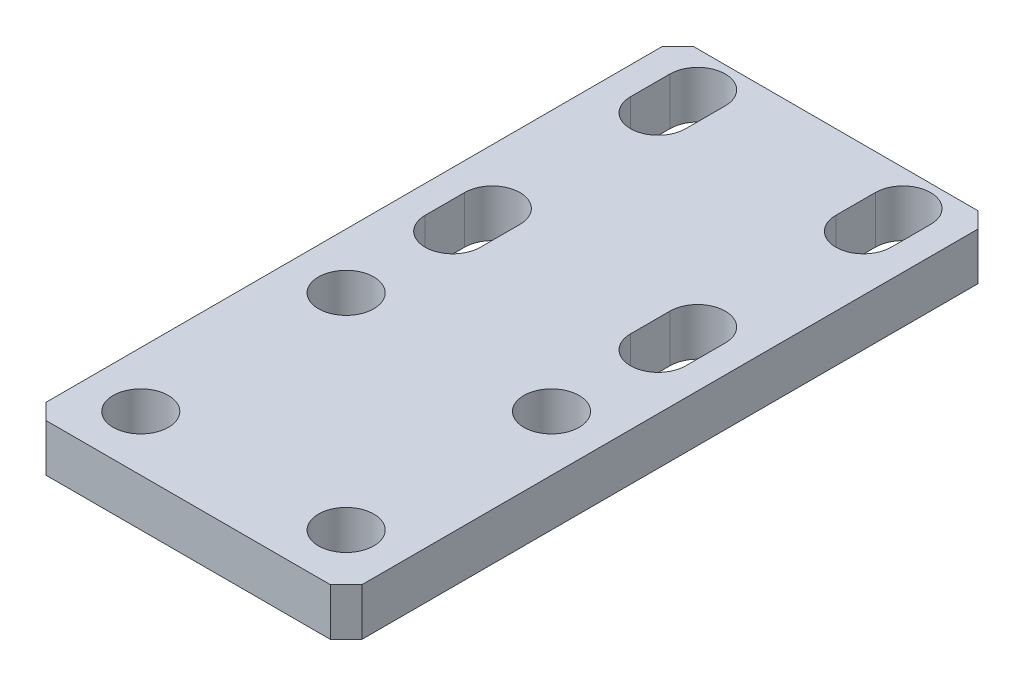
ISO-10303-21;
HEADER;
FILE_DESCRIPTION(('STEP AP214'),'2;1');
FILE_NAME('part.step','',(''),(''),'','','');
FILE_SCHEMA(('AUTOMOTIVE_DESIGN { 1 0 10303 214 1 1 1 1 }'));
ENDSEC;
DATA;
#1=APPLICATION_CONTEXT('core data for automotive mechanical design processes');
#2=APPLICATION_PROTOCOL_DEFINITION('international standard','automotive_design',2000,#1);
#3=PRODUCT_CONTEXT('',#1,'mechanical');
#4=PRODUCT('Part','Part','',(#3));
#5=PRODUCT_RELATED_PRODUCT_CATEGORY('part','',(#4));
#6=PRODUCT_DEFINITION_FORMATION('','',#4);
#7=PRODUCT_DEFINITION_CONTEXT('part definition',#1,'design');
#8=PRODUCT_DEFINITION('design','',#6,#7);
#9=PRODUCT_DEFINITION_SHAPE('','',#8);
#10=(LENGTH_UNIT() NAMED_UNIT(*) SI_UNIT(.MILLI.,.METRE.));
#11=(NAMED_UNIT(*) PLANE_ANGLE_UNIT() SI_UNIT($,.RADIAN.));
#12=(NAMED_UNIT(*) SI_UNIT($,.STERADIAN.) SOLID_ANGLE_UNIT());
#13=UNCERTAINTY_MEASURE_WITH_UNIT(LENGTH_MEASURE(1.E-05),#10,'distance_accuracy_value','');
#14=(GEOMETRIC_REPRESENTATION_CONTEXT(3) GLOBAL_UNCERTAINTY_ASSIGNED_CONTEXT((#13)) GLOBAL_UNIT_ASSIGNED_CONTEXT((#10,
#11,#12)) REPRESENTATION_CONTEXT('',''));
#15=CARTESIAN_POINT('',(0.,0.,0.));
#16=DIRECTION('',(0.,0.,1.));
#17=DIRECTION('',(1.,0.,0.));
#18=AXIS2_PLACEMENT_3D('',#15,#16,#17);
#19=CARTESIAN_POINT('',(0.,-3.,0.));
#20=DIRECTION('',(0.,1.,0.));
#21=DIRECTION('',(0.,0.,1.));
#22=AXIS2_PLACEMENT_3D('',#19,#20,#21);
#23=PLANE('',#22);
#24=CARTESIAN_POINT('',(13.,-3.,34.));
#25=DIRECTION('',(0.,1.,0.));
#26=DIRECTION('',(0.,0.,1.));
#27=AXIS2_PLACEMENT_3D('',#24,#25,#26);
#28=CIRCLE('',#27,3.5);
#29=CARTESIAN_POINT('',(13.,-3.,37.5));
#30=VERTEX_POINT('',#29);
#31=EDGE_CURVE('E284',#30,#30,#28,.T.);
#32=ORIENTED_EDGE('',*,*,#31,.T.);
#33=EDGE_LOOP('',(#32));
#34=FACE_BOUND('',#33,.T.);
#35=CARTESIAN_POINT('',(-13.,-3.,34.));
#36=DIRECTION('',(0.,1.,0.));
#37=DIRECTION('',(0.,0.,1.));
#38=AXIS2_PLACEMENT_3D('',#35,#36,#37);
#39=CIRCLE('',#38,3.5);
#40=CARTESIAN_POINT('',(-13.,-3.,37.5));
#41=VERTEX_POINT('',#40);
#42=EDGE_CURVE('E288',#41,#41,#39,.T.);
#43=ORIENTED_EDGE('',*,*,#42,.T.);
#44=EDGE_LOOP('',(#43));
#45=FACE_BOUND('',#44,.T.);
#46=CARTESIAN_POINT('',(-13.,-3.,8.00000000000002));
#47=DIRECTION('',(0.,1.,0.));
#48=DIRECTION('',(0.,0.,1.));
#49=AXIS2_PLACEMENT_3D('',#46,#47,#48);
#50=CIRCLE('',#49,3.5);
#51=CARTESIAN_POINT('',(-13.,-3.,11.5));
#52=VERTEX_POINT('',#51);
#53=EDGE_CURVE('E291',#52,#52,#50,.T.);
#54=ORIENTED_EDGE('',*,*,#53,.T.);
#55=EDGE_LOOP('',(#54));
#56=FACE_BOUND('',#55,.T.);
#57=DIRECTION('',(0.,0.,1.));
#58=VECTOR('',#57,1.);
#59=CARTESIAN_POINT('',(9.49999999999999,-3.,-36.5));
#60=LINE('',#59,#58);
#61=CARTESIAN_POINT('',(9.49999999999999,-3.,-36.5));
#62=VERTEX_POINT('',#61);
#63=CARTESIAN_POINT('',(9.49999999999999,-3.,-31.5));
#64=VERTEX_POINT('',#63);
#65=EDGE_CURVE('E221',#62,#64,#60,.T.);
#66=ORIENTED_EDGE('',*,*,#65,.T.);
#67=CARTESIAN_POINT('',(13.,-3.,-31.5));
#68=DIRECTION('',(0.,1.,0.));
#69=DIRECTION('',(0.,0.,1.));
#70=AXIS2_PLACEMENT_3D('',#67,#68,#69);
#71=CIRCLE('',#70,3.5);
#72=CARTESIAN_POINT('',(16.5,-3.,-31.5));
#73=VERTEX_POINT('',#72);
#74=EDGE_CURVE('E224',#64,#73,#71,.T.);
#75=ORIENTED_EDGE('',*,*,#74,.T.);
#76=DIRECTION('',(0.,0.,-1.));
#77=VECTOR('',#76,1.);
#78=CARTESIAN_POINT('',(16.5,-3.,-36.5));
#79=LINE('',#78,#77);
#80=CARTESIAN_POINT('',(16.5,-3.,-36.5));
#81=VERTEX_POINT('',#80);
#82=EDGE_CURVE('E218',#73,#81,#79,.T.);
#83=ORIENTED_EDGE('',*,*,#82,.T.);
#84=CARTESIAN_POINT('',(13.,-3.,-36.5));
#85=DIRECTION('',(0.,1.,0.));
#86=DIRECTION('',(0.,0.,1.));
#87=AXIS2_PLACEMENT_3D('',#84,#85,#86);
#88=CIRCLE('',#87,3.5);
#89=EDGE_CURVE('E294',#81,#62,#88,.T.);
#90=ORIENTED_EDGE('',*,*,#89,.T.);
#91=EDGE_LOOP('',(#66,#75,#83,#90));
#92=FACE_BOUND('',#91,.T.);
#93=CARTESIAN_POINT('',(13.,-3.,-5.50000000000002));
#94=DIRECTION('',(0.,1.,0.));
#95=DIRECTION('',(0.,0.,1.));
#96=AXIS2_PLACEMENT_3D('',#93,#94,#95);
#97=CIRCLE('',#96,3.49999999999999);
#98=CARTESIAN_POINT('',(9.49999999999998,-3.,-5.50000000000002));
#99=VERTEX_POINT('',#98);
#100=CARTESIAN_POINT('',(16.5,-3.,-5.50000000000002));
#101=VERTEX_POINT('',#100);
#102=EDGE_CURVE('E228',#99,#101,#97,.T.);
#103=ORIENTED_EDGE('',*,*,#102,.T.);
#104=DIRECTION('',(0.,0.,-1.));
#105=VECTOR('',#104,1.);
#106=CARTESIAN_POINT('',(16.5,-3.,-5.50000000000003));
#107=LINE('',#106,#105);
#108=CARTESIAN_POINT('',(16.5,-3.,-10.5));
#109=VERTEX_POINT('',#108);
#110=EDGE_CURVE('E229',#101,#109,#107,.T.);
#111=ORIENTED_EDGE('',*,*,#110,.T.);
#112=CARTESIAN_POINT('',(13.,-3.,-10.5));
#113=DIRECTION('',(0.,1.,0.));
#114=DIRECTION('',(0.,0.,1.));
#115=AXIS2_PLACEMENT_3D('',#112,#113,#114);
#116=CIRCLE('',#115,3.49999999999999);
#117=CARTESIAN_POINT('',(9.49999999999997,-3.,-10.5));
#118=VERTEX_POINT('',#117);
#119=EDGE_CURVE('E299',#109,#118,#116,.T.);
#120=ORIENTED_EDGE('',*,*,#119,.T.);
#121=DIRECTION('',(0.,0.,1.));
#122=VECTOR('',#121,1.);
#123=CARTESIAN_POINT('',(9.49999999999998,-3.,-5.50000000000002));
#124=LINE('',#123,#122);
#125=EDGE_CURVE('E225',#118,#99,#124,.T.);
#126=ORIENTED_EDGE('',*,*,#125,.T.);
#127=EDGE_LOOP('',(#103,#111,#120,#126));
#128=FACE_BOUND('',#127,.T.);
#129=CARTESIAN_POINT('',(-13.,-3.,-5.50000000000002));
#130=DIRECTION('',(0.,1.,0.));
#131=DIRECTION('',(0.,0.,1.));
#132=AXIS2_PLACEMENT_3D('',#129,#130,#131);
#133=CIRCLE('',#132,3.49999999999999);
#134=CARTESIAN_POINT('',(-16.5,-3.,-5.50000000000002));
#135=VERTEX_POINT('',#134);
#136=CARTESIAN_POINT('',(-9.49999999999998,-3.,-5.50000000000002));
#137=VERTEX_POINT('',#136);
#138=EDGE_CURVE('E236',#135,#137,#133,.T.);
#139=ORIENTED_EDGE('',*,*,#138,.T.);
#140=DIRECTION('',(0.,0.,-1.));
#141=VECTOR('',#140,1.);
#142=CARTESIAN_POINT('',(-9.49999999999998,-3.,-5.50000000000002));
#143=LINE('',#142,#141);
#144=CARTESIAN_POINT('',(-9.49999999999998,-3.,-10.5));
#145=VERTEX_POINT('',#144);
#146=EDGE_CURVE('E237',#137,#145,#143,.T.);
#147=ORIENTED_EDGE('',*,*,#146,.T.);
#148=CARTESIAN_POINT('',(-13.,-3.,-10.5));
#149=DIRECTION('',(0.,1.,0.));
#150=DIRECTION('',(0.,0.,1.));
#151=AXIS2_PLACEMENT_3D('',#148,#149,#150);
#152=CIRCLE('',#151,3.49999999999999);
#153=CARTESIAN_POINT('',(-16.5,-3.,-10.5));
#154=VERTEX_POINT('',#153);
#155=EDGE_CURVE('E303',#145,#154,#152,.T.);
#156=ORIENTED_EDGE('',*,*,#155,.T.);
#157=DIRECTION('',(0.,0.,1.));
#158=VECTOR('',#157,1.);
#159=CARTESIAN_POINT('',(-16.5,-3.,-5.50000000000003));
#160=LINE('',#159,#158);
#161=EDGE_CURVE('E233',#154,#135,#160,.T.);
#162=ORIENTED_EDGE('',*,*,#161,.T.);
#163=EDGE_LOOP('',(#139,#147,#156,#162));
#164=FACE_BOUND('',#163,.T.);
#165=DIRECTION('',(0.,0.,1.));
#166=VECTOR('',#165,1.);
#167=CARTESIAN_POINT('',(-16.5,-3.,-36.5));
#168=LINE('',#167,#166);
#169=CARTESIAN_POINT('',(-16.5,-3.,-36.5));
#170=VERTEX_POINT('',#169);
#171=CARTESIAN_POINT('',(-16.5,-3.,-31.5));
#172=VERTEX_POINT('',#171);
#173=EDGE_CURVE('E157',#170,#172,#168,.T.);
#174=ORIENTED_EDGE('',*,*,#173,.T.);
#175=CARTESIAN_POINT('',(-13.,-3.,-31.5));
#176=DIRECTION('',(0.,1.,0.));
#177=DIRECTION('',(0.,0.,1.));
#178=AXIS2_PLACEMENT_3D('',#175,#176,#177);
#179=CIRCLE('',#178,3.5);
#180=CARTESIAN_POINT('',(-9.5,-3.,-31.5));
#181=VERTEX_POINT('',#180);
#182=EDGE_CURVE('E245',#172,#181,#179,.T.);
#183=ORIENTED_EDGE('',*,*,#182,.T.);
#184=DIRECTION('',(0.,0.,-1.));
#185=VECTOR('',#184,1.);
#186=CARTESIAN_POINT('',(-9.5,-3.,-36.5));
#187=LINE('',#186,#185);
#188=CARTESIAN_POINT('',(-9.5,-3.,-36.5));
#189=VERTEX_POINT('',#188);
#190=EDGE_CURVE('E241',#181,#189,#187,.T.);
#191=ORIENTED_EDGE('',*,*,#190,.T.);
#192=CARTESIAN_POINT('',(-13.,-3.,-36.5));
#193=DIRECTION('',(0.,1.,0.));
#194=DIRECTION('',(0.,0.,1.));
#195=AXIS2_PLACEMENT_3D('',#192,#193,#194);
#196=CIRCLE('',#195,3.5);
#197=EDGE_CURVE('E307',#189,#170,#196,.T.);
#198=ORIENTED_EDGE('',*,*,#197,.T.);
#199=EDGE_LOOP('',(#174,#183,#191,#198));
#200=FACE_BOUND('',#199,.T.);
#201=CARTESIAN_POINT('',(13.,-3.,8.00000000000002));
#202=DIRECTION('',(0.,1.,0.));
#203=DIRECTION('',(0.,0.,1.));
#204=AXIS2_PLACEMENT_3D('',#201,#202,#203);
#205=CIRCLE('',#204,3.5);
#206=CARTESIAN_POINT('',(13.,-3.,11.5));
#207=VERTEX_POINT('',#206);
#208=EDGE_CURVE('E45',#207,#207,#205,.T.);
#209=ORIENTED_EDGE('',*,*,#208,.T.);
#210=EDGE_LOOP('',(#209));
#211=FACE_BOUND('',#210,.T.);
#212=DIRECTION('',(1.,0.,0.));
#213=VECTOR('',#212,1.);
#214=CARTESIAN_POINT('',(-20.,-3.,-41.));
#215=LINE('',#214,#213);
#216=CARTESIAN_POINT('',(-18.,-3.,-41.));
#217=VERTEX_POINT('',#216);
#218=CARTESIAN_POINT('',(18.,-3.,-41.));
#219=VERTEX_POINT('',#218);
#220=EDGE_CURVE('E194',#217,#219,#215,.T.);
#221=ORIENTED_EDGE('',*,*,#220,.T.);
#222=DIRECTION('',(0.707106781186546,0.,0.707106781186549));
#223=VECTOR('',#222,1.);
#224=CARTESIAN_POINT('',(18.,-3.,-41.));
#225=LINE('',#224,#223);
#226=CARTESIAN_POINT('',(20.,-3.,-39.));
#227=VERTEX_POINT('',#226);
#228=EDGE_CURVE('E189',#219,#227,#225,.T.);
#229=ORIENTED_EDGE('',*,*,#228,.T.);
#230=DIRECTION('',(0.,0.,1.));
#231=VECTOR('',#230,1.);
#232=CARTESIAN_POINT('',(20.,-3.,-41.));
#233=LINE('',#232,#231);
#234=CARTESIAN_POINT('',(20.,-3.,39.));
#235=VERTEX_POINT('',#234);
#236=EDGE_CURVE('E191',#227,#235,#233,.T.);
#237=ORIENTED_EDGE('',*,*,#236,.T.);
#238=DIRECTION('',(-0.707106781186546,0.,0.707106781186549));
#239=VECTOR('',#238,1.);
#240=CARTESIAN_POINT('',(20.,-3.,39.));
#241=LINE('',#240,#239);
#242=CARTESIAN_POINT('',(18.,-3.,41.));
#243=VERTEX_POINT('',#242);
#244=EDGE_CURVE('E166',#235,#243,#241,.T.);
#245=ORIENTED_EDGE('',*,*,#244,.T.);
#246=DIRECTION('',(-1.,0.,0.));
#247=VECTOR('',#246,1.);
#248=CARTESIAN_POINT('',(-20.,-3.,41.));
#249=LINE('',#248,#247);
#250=CARTESIAN_POINT('',(-18.,-3.,41.));
#251=VERTEX_POINT('',#250);
#252=EDGE_CURVE('E328',#243,#251,#249,.T.);
#253=ORIENTED_EDGE('',*,*,#252,.T.);
#254=DIRECTION('',(-0.707106781186545,0.,-0.70710678118655));
#255=VECTOR('',#254,1.);
#256=CARTESIAN_POINT('',(-18.,-3.00000000000001,41.));
#257=LINE('',#256,#255);
#258=CARTESIAN_POINT('',(-20.,-3.,39.));
#259=VERTEX_POINT('',#258);
#260=EDGE_CURVE('E333',#251,#259,#257,.T.);
#261=ORIENTED_EDGE('',*,*,#260,.T.);
#262=DIRECTION('',(0.,0.,-1.));
#263=VECTOR('',#262,1.);
#264=CARTESIAN_POINT('',(-20.,-3.,-41.));
#265=LINE('',#264,#263);
#266=CARTESIAN_POINT('',(-20.,-3.,-39.));
#267=VERTEX_POINT('',#266);
#268=EDGE_CURVE('E338',#259,#267,#265,.T.);
#269=ORIENTED_EDGE('',*,*,#268,.T.);
#270=DIRECTION('',(0.707106781186548,0.,-0.707106781186548));
#271=VECTOR('',#270,1.);
#272=CARTESIAN_POINT('',(-20.,-3.00000000000001,-39.));
#273=LINE('',#272,#271);
#274=EDGE_CURVE('E343',#267,#217,#273,.T.);
#275=ORIENTED_EDGE('',*,*,#274,.T.);
#276=EDGE_LOOP('',(#221,#229,#237,#245,#253,#261,#269,#275));
#277=FACE_BOUND('',#276,.T.);
#278=ADVANCED_FACE('F42',(#34,#45,#56,#92,#128,#164,#200,#211,#277),#23,.F.);
#279=CARTESIAN_POINT('',(20.,3.,-41.));
#280=DIRECTION('',(-1.,0.,0.));
#281=DIRECTION('',(0.,0.,1.));
#282=AXIS2_PLACEMENT_3D('',#279,#280,#281);
#283=PLANE('',#282);
#284=DIRECTION('',(0.,0.,1.));
#285=VECTOR('',#284,1.);
#286=CARTESIAN_POINT('',(20.,3.,0.));
#287=LINE('',#286,#285);
#288=CARTESIAN_POINT('',(20.,3.,39.));
#289=VERTEX_POINT('',#288);
#290=CARTESIAN_POINT('',(20.,3.,-39.));
#291=VERTEX_POINT('',#290);
#292=EDGE_CURVE('E287',#289,#291,#287,.F.);
#293=ORIENTED_EDGE('',*,*,#292,.F.);
#294=DIRECTION('',(0.,1.,0.));
#295=VECTOR('',#294,1.);
#296=CARTESIAN_POINT('',(20.,3.,39.));
#297=LINE('',#296,#295);
#298=EDGE_CURVE('E207',#289,#235,#297,.F.);
#299=ORIENTED_EDGE('',*,*,#298,.T.);
#300=ORIENTED_EDGE('',*,*,#236,.F.);
#301=DIRECTION('',(0.,1.,0.));
#302=VECTOR('',#301,1.);
#303=CARTESIAN_POINT('',(20.,3.,-39.));
#304=LINE('',#303,#302);
#305=EDGE_CURVE('E199',#227,#291,#304,.T.);
#306=ORIENTED_EDGE('',*,*,#305,.T.);
#307=EDGE_LOOP('',(#293,#299,#300,#306));
#308=FACE_BOUND('',#307,.T.);
#309=ADVANCED_FACE('F204',(#308),#283,.F.);
#310=CARTESIAN_POINT('',(18.,3.,-41.));
#311=DIRECTION('',(-0.707106781186549,0.,0.707106781186546));
#312=DIRECTION('',(0.707106781186546,0.,0.707106781186549));
#313=AXIS2_PLACEMENT_3D('',#310,#311,#312);
#314=PLANE('',#313);
#315=ORIENTED_EDGE('',*,*,#228,.F.);
#316=DIRECTION('',(0.,1.,0.));
#317=VECTOR('',#316,1.);
#318=CARTESIAN_POINT('',(18.,3.,-41.));
#319=LINE('',#318,#317);
#320=CARTESIAN_POINT('',(18.,3.,-41.));
#321=VERTEX_POINT('',#320);
#322=EDGE_CURVE('E214',#219,#321,#319,.T.);
#323=ORIENTED_EDGE('',*,*,#322,.T.);
#324=DIRECTION('',(-0.707106781186546,0.,-0.707106781186549));
#325=VECTOR('',#324,1.);
#326=CARTESIAN_POINT('',(20.,3.,-39.));
#327=LINE('',#326,#325);
#328=EDGE_CURVE('E211',#291,#321,#327,.T.);
#329=ORIENTED_EDGE('',*,*,#328,.F.);
#330=ORIENTED_EDGE('',*,*,#305,.F.);
#331=EDGE_LOOP('',(#315,#323,#329,#330));
#332=FACE_BOUND('',#331,.T.);
#333=ADVANCED_FACE('F209',(#332),#314,.F.);
#334=CARTESIAN_POINT('',(-20.,3.,-41.));
#335=DIRECTION('',(0.,0.,1.));
#336=DIRECTION('',(1.,0.,0.));
#337=AXIS2_PLACEMENT_3D('',#334,#335,#336);
#338=PLANE('',#337);
#339=DIRECTION('',(1.,0.,0.));
#340=VECTOR('',#339,1.);
#341=CARTESIAN_POINT('',(0.,3.,-41.));
#342=LINE('',#341,#340);
#343=CARTESIAN_POINT('',(-18.,3.,-41.));
#344=VERTEX_POINT('',#343);
#345=EDGE_CURVE('E350',#321,#344,#342,.F.);
#346=ORIENTED_EDGE('',*,*,#345,.F.);
#347=ORIENTED_EDGE('',*,*,#322,.F.);
#348=ORIENTED_EDGE('',*,*,#220,.F.);
#349=DIRECTION('',(0.,1.,0.));
#350=VECTOR('',#349,1.);
#351=CARTESIAN_POINT('',(-18.,3.,-41.));
#352=LINE('',#351,#350);
#353=EDGE_CURVE('E340',#217,#344,#352,.T.);
#354=ORIENTED_EDGE('',*,*,#353,.T.);
#355=EDGE_LOOP('',(#346,#347,#348,#354));
#356=FACE_BOUND('',#355,.T.);
#357=ADVANCED_FACE('F351',(#356),#338,.F.);
#358=CARTESIAN_POINT('',(-20.,3.,-39.));
#359=DIRECTION('',(0.707106781186548,0.,0.707106781186548));
#360=DIRECTION('',(0.707106781186548,0.,-0.707106781186548));
#361=AXIS2_PLACEMENT_3D('',#358,#359,#360);
#362=PLANE('',#361);
#363=ORIENTED_EDGE('',*,*,#274,.F.);
#364=DIRECTION('',(0.,1.,0.));
#365=VECTOR('',#364,1.);
#366=CARTESIAN_POINT('',(-20.,3.,-39.));
#367=LINE('',#366,#365);
#368=CARTESIAN_POINT('',(-20.,3.,-39.));
#369=VERTEX_POINT('',#368);
#370=EDGE_CURVE('E335',#267,#369,#367,.T.);
#371=ORIENTED_EDGE('',*,*,#370,.T.);
#372=DIRECTION('',(-0.707106781186546,0.,0.707106781186549));
#373=VECTOR('',#372,1.);
#374=CARTESIAN_POINT('',(-18.,3.,-41.));
#375=LINE('',#374,#373);
#376=EDGE_CURVE('E356',#344,#369,#375,.T.);
#377=ORIENTED_EDGE('',*,*,#376,.F.);
#378=ORIENTED_EDGE('',*,*,#353,.F.);
#379=EDGE_LOOP('',(#363,#371,#377,#378));
#380=FACE_BOUND('',#379,.T.);
#381=ADVANCED_FACE('F418',(#380),#362,.F.);
#382=CARTESIAN_POINT('',(-20.,3.,-41.));
#383=DIRECTION('',(1.,0.,0.));
#384=DIRECTION('',(0.,0.,-1.));
#385=AXIS2_PLACEMENT_3D('',#382,#383,#384);
#386=PLANE('',#385);
#387=ORIENTED_EDGE('',*,*,#268,.F.);
#388=DIRECTION('',(0.,1.,0.));
#389=VECTOR('',#388,1.);
#390=CARTESIAN_POINT('',(-20.,3.,39.));
#391=LINE('',#390,#389);
#392=CARTESIAN_POINT('',(-20.,3.,39.));
#393=VERTEX_POINT('',#392);
#394=EDGE_CURVE('E330',#259,#393,#391,.T.);
#395=ORIENTED_EDGE('',*,*,#394,.T.);
#396=DIRECTION('',(0.,0.,1.));
#397=VECTOR('',#396,1.);
#398=CARTESIAN_POINT('',(-20.,3.,0.));
#399=LINE('',#398,#397);
#400=EDGE_CURVE('E410',#369,#393,#399,.T.);
#401=ORIENTED_EDGE('',*,*,#400,.F.);
#402=ORIENTED_EDGE('',*,*,#370,.F.);
#403=EDGE_LOOP('',(#387,#395,#401,#402));
#404=FACE_BOUND('',#403,.T.);
#405=ADVANCED_FACE('F435',(#404),#386,.F.);
#406=CARTESIAN_POINT('',(-18.,3.,41.));
#407=DIRECTION('',(0.70710678118655,0.,-0.707106781186545));
#408=DIRECTION('',(-0.707106781186545,0.,-0.70710678118655));
#409=AXIS2_PLACEMENT_3D('',#406,#407,#408);
#410=PLANE('',#409);
#411=ORIENTED_EDGE('',*,*,#260,.F.);
#412=DIRECTION('',(0.,1.,0.));
#413=VECTOR('',#412,1.);
#414=CARTESIAN_POINT('',(-18.,3.,41.));
#415=LINE('',#414,#413);
#416=CARTESIAN_POINT('',(-18.,3.,41.));
#417=VERTEX_POINT('',#416);
#418=EDGE_CURVE('E325',#251,#417,#415,.T.);
#419=ORIENTED_EDGE('',*,*,#418,.T.);
#420=DIRECTION('',(0.707106781186544,0.,0.707106781186551));
#421=VECTOR('',#420,1.);
#422=CARTESIAN_POINT('',(-20.,3.,39.));
#423=LINE('',#422,#421);
#424=EDGE_CURVE('E407',#393,#417,#423,.T.);
#425=ORIENTED_EDGE('',*,*,#424,.F.);
#426=ORIENTED_EDGE('',*,*,#394,.F.);
#427=EDGE_LOOP('',(#411,#419,#425,#426));
#428=FACE_BOUND('',#427,.T.);
#429=ADVANCED_FACE('F436',(#428),#410,.F.);
#430=CARTESIAN_POINT('',(-20.,3.,41.));
#431=DIRECTION('',(0.,0.,-1.));
#432=DIRECTION('',(-1.,0.,0.));
#433=AXIS2_PLACEMENT_3D('',#430,#431,#432);
#434=PLANE('',#433);
#435=ORIENTED_EDGE('',*,*,#252,.F.);
#436=DIRECTION('',(0.,1.,0.));
#437=VECTOR('',#436,1.);
#438=CARTESIAN_POINT('',(18.,3.,41.));
#439=LINE('',#438,#437);
#440=CARTESIAN_POINT('',(18.,3.,41.));
#441=VERTEX_POINT('',#440);
#442=EDGE_CURVE('E311',#243,#441,#439,.T.);
#443=ORIENTED_EDGE('',*,*,#442,.T.);
#444=DIRECTION('',(1.,0.,0.));
#445=VECTOR('',#444,1.);
#446=CARTESIAN_POINT('',(0.,3.,41.));
#447=LINE('',#446,#445);
#448=EDGE_CURVE('E405',#417,#441,#447,.T.);
#449=ORIENTED_EDGE('',*,*,#448,.F.);
#450=ORIENTED_EDGE('',*,*,#418,.F.);
#451=EDGE_LOOP('',(#435,#443,#449,#450));
#452=FACE_BOUND('',#451,.T.);
#453=ADVANCED_FACE('F428',(#452),#434,.F.);
#454=CARTESIAN_POINT('',(20.,3.,39.));
#455=DIRECTION('',(-0.707106781186549,0.,-0.707106781186546));
#456=DIRECTION('',(-0.707106781186546,0.,0.707106781186549));
#457=AXIS2_PLACEMENT_3D('',#454,#455,#456);
#458=PLANE('',#457);
#459=ORIENTED_EDGE('',*,*,#244,.F.);
#460=ORIENTED_EDGE('',*,*,#298,.F.);
#461=DIRECTION('',(0.707106781186546,0.,-0.707106781186549));
#462=VECTOR('',#461,1.);
#463=CARTESIAN_POINT('',(18.,3.,41.));
#464=LINE('',#463,#462);
#465=EDGE_CURVE('E283',#441,#289,#464,.T.);
#466=ORIENTED_EDGE('',*,*,#465,.F.);
#467=ORIENTED_EDGE('',*,*,#442,.F.);
#468=EDGE_LOOP('',(#459,#460,#466,#467));
#469=FACE_BOUND('',#468,.T.);
#470=ADVANCED_FACE('F423',(#469),#458,.F.);
#471=CARTESIAN_POINT('',(13.,-3.,8.00000000000002));
#472=DIRECTION('',(0.,1.,0.));
#473=DIRECTION('',(0.,0.,1.));
#474=AXIS2_PLACEMENT_3D('',#471,#472,#473);
#475=CYLINDRICAL_SURFACE('',#474,3.5);
#476=ORIENTED_EDGE('',*,*,#208,.F.);
#477=EDGE_LOOP('',(#476));
#478=FACE_BOUND('',#477,.T.);
#479=CARTESIAN_POINT('',(13.,3.,8.00000000000002));
#480=DIRECTION('',(0.,1.,0.));
#481=DIRECTION('',(0.,0.,1.));
#482=AXIS2_PLACEMENT_3D('',#479,#480,#481);
#483=CIRCLE('',#482,3.5);
#484=CARTESIAN_POINT('',(13.,3.,11.5));
#485=VERTEX_POINT('',#484);
#486=EDGE_CURVE('E280',#485,#485,#483,.F.);
#487=ORIENTED_EDGE('',*,*,#486,.F.);
#488=EDGE_LOOP('',(#487));
#489=FACE_BOUND('',#488,.T.);
#490=ADVANCED_FACE('F522',(#478,#489),#475,.F.);
#491=CARTESIAN_POINT('',(-13.,-3.,-31.5));
#492=DIRECTION('',(0.,1.,0.));
#493=DIRECTION('',(0.,0.,1.));
#494=AXIS2_PLACEMENT_3D('',#491,#492,#493);
#495=CYLINDRICAL_SURFACE('',#494,3.5);
#496=ORIENTED_EDGE('',*,*,#182,.F.);
#497=DIRECTION('',(0.,1.,0.));
#498=VECTOR('',#497,1.);
#499=CARTESIAN_POINT('',(-16.5,-3.,-31.5));
#500=LINE('',#499,#498);
#501=CARTESIAN_POINT('',(-16.5,3.,-31.5));
#502=VERTEX_POINT('',#501);
#503=EDGE_CURVE('E244',#172,#502,#500,.T.);
#504=ORIENTED_EDGE('',*,*,#503,.T.);
#505=CARTESIAN_POINT('',(-13.,3.,-31.5));
#506=DIRECTION('',(0.,1.,0.));
#507=DIRECTION('',(0.,0.,1.));
#508=AXIS2_PLACEMENT_3D('',#505,#506,#507);
#509=CIRCLE('',#508,3.5);
#510=CARTESIAN_POINT('',(-9.5,3.,-31.5));
#511=VERTEX_POINT('',#510);
#512=EDGE_CURVE('E278',#511,#502,#509,.F.);
#513=ORIENTED_EDGE('',*,*,#512,.F.);
#514=DIRECTION('',(0.,1.,0.));
#515=VECTOR('',#514,1.);
#516=CARTESIAN_POINT('',(-9.5,-3.,-31.5));
#517=LINE('',#516,#515);
#518=EDGE_CURVE('E243',#511,#181,#517,.F.);
#519=ORIENTED_EDGE('',*,*,#518,.T.);
#520=EDGE_LOOP('',(#496,#504,#513,#519));
#521=FACE_BOUND('',#520,.T.);
#522=ADVANCED_FACE('F519',(#521),#495,.F.);
#523=CARTESIAN_POINT('',(-16.5,-3.,-36.5));
#524=DIRECTION('',(-1.,0.,0.));
#525=DIRECTION('',(0.,0.,1.));
#526=AXIS2_PLACEMENT_3D('',#523,#524,#525);
#527=PLANE('',#526);
#528=ORIENTED_EDGE('',*,*,#173,.F.);
#529=DIRECTION('',(0.,1.,0.));
#530=VECTOR('',#529,1.);
#531=CARTESIAN_POINT('',(-16.5,-3.,-36.5));
#532=LINE('',#531,#530);
#533=CARTESIAN_POINT('',(-16.5,3.,-36.5));
#534=VERTEX_POINT('',#533);
#535=EDGE_CURVE('E308',#170,#534,#532,.T.);
#536=ORIENTED_EDGE('',*,*,#535,.T.);
#537=DIRECTION('',(0.,0.,1.));
#538=VECTOR('',#537,1.);
#539=CARTESIAN_POINT('',(-16.5,3.,0.));
#540=LINE('',#539,#538);
#541=EDGE_CURVE('E277',#502,#534,#540,.F.);
#542=ORIENTED_EDGE('',*,*,#541,.F.);
#543=ORIENTED_EDGE('',*,*,#503,.F.);
#544=EDGE_LOOP('',(#528,#536,#542,#543));
#545=FACE_BOUND('',#544,.T.);
#546=ADVANCED_FACE('F388',(#545),#527,.F.);
#547=CARTESIAN_POINT('',(-13.,-3.,-36.5));
#548=DIRECTION('',(0.,1.,0.));
#549=DIRECTION('',(0.,0.,1.));
#550=AXIS2_PLACEMENT_3D('',#547,#548,#549);
#551=CYLINDRICAL_SURFACE('',#550,3.5);
#552=ORIENTED_EDGE('',*,*,#197,.F.);
#553=DIRECTION('',(0.,1.,0.));
#554=VECTOR('',#553,1.);
#555=CARTESIAN_POINT('',(-9.5,-3.,-36.5));
#556=LINE('',#555,#554);
#557=CARTESIAN_POINT('',(-9.5,3.,-36.5));
#558=VERTEX_POINT('',#557);
#559=EDGE_CURVE('E240',#189,#558,#556,.T.);
#560=ORIENTED_EDGE('',*,*,#559,.T.);
#561=CARTESIAN_POINT('',(-13.,3.,-36.5));
#562=DIRECTION('',(0.,1.,0.));
#563=DIRECTION('',(0.,0.,1.));
#564=AXIS2_PLACEMENT_3D('',#561,#562,#563);
#565=CIRCLE('',#564,3.5);
#566=EDGE_CURVE('E273',#534,#558,#565,.F.);
#567=ORIENTED_EDGE('',*,*,#566,.F.);
#568=ORIENTED_EDGE('',*,*,#535,.F.);
#569=EDGE_LOOP('',(#552,#560,#567,#568));
#570=FACE_BOUND('',#569,.T.);
#571=ADVANCED_FACE('F393',(#570),#551,.F.);
#572=CARTESIAN_POINT('',(-9.5,-3.,-36.5));
#573=DIRECTION('',(1.,0.,0.));
#574=DIRECTION('',(0.,0.,-1.));
#575=AXIS2_PLACEMENT_3D('',#572,#573,#574);
#576=PLANE('',#575);
#577=ORIENTED_EDGE('',*,*,#190,.F.);
#578=ORIENTED_EDGE('',*,*,#518,.F.);
#579=DIRECTION('',(0.,0.,1.));
#580=VECTOR('',#579,1.);
#581=CARTESIAN_POINT('',(-9.5,3.,0.));
#582=LINE('',#581,#580);
#583=EDGE_CURVE('E276',#558,#511,#582,.T.);
#584=ORIENTED_EDGE('',*,*,#583,.F.);
#585=ORIENTED_EDGE('',*,*,#559,.F.);
#586=EDGE_LOOP('',(#577,#578,#584,#585));
#587=FACE_BOUND('',#586,.T.);
#588=ADVANCED_FACE('F510',(#587),#576,.F.);
#589=CARTESIAN_POINT('',(-9.49999999999998,-3.,-5.50000000000002));
#590=DIRECTION('',(1.,0.,0.));
#591=DIRECTION('',(0.,0.,-1.));
#592=AXIS2_PLACEMENT_3D('',#589,#590,#591);
#593=PLANE('',#592);
#594=ORIENTED_EDGE('',*,*,#146,.F.);
#595=DIRECTION('',(0.,1.,0.));
#596=VECTOR('',#595,1.);
#597=CARTESIAN_POINT('',(-9.49999999999997,-3.,-5.50000000000002));
#598=LINE('',#597,#596);
#599=CARTESIAN_POINT('',(-9.49999999999998,3.,-5.50000000000002));
#600=VERTEX_POINT('',#599);
#601=EDGE_CURVE('E239',#137,#600,#598,.T.);
#602=ORIENTED_EDGE('',*,*,#601,.T.);
#603=DIRECTION('',(0.,0.,1.));
#604=VECTOR('',#603,1.);
#605=CARTESIAN_POINT('',(-9.49999999999998,3.,0.));
#606=LINE('',#605,#604);
#607=CARTESIAN_POINT('',(-9.49999999999998,3.,-10.5));
#608=VERTEX_POINT('',#607);
#609=EDGE_CURVE('E272',#608,#600,#606,.T.);
#610=ORIENTED_EDGE('',*,*,#609,.F.);
#611=DIRECTION('',(0.,1.,0.));
#612=VECTOR('',#611,1.);
#613=CARTESIAN_POINT('',(-9.49999999999998,-3.,-10.5));
#614=LINE('',#613,#612);
#615=EDGE_CURVE('E305',#608,#145,#614,.F.);
#616=ORIENTED_EDGE('',*,*,#615,.T.);
#617=EDGE_LOOP('',(#594,#602,#610,#616));
#618=FACE_BOUND('',#617,.T.);
#619=ADVANCED_FACE('F506',(#618),#593,.F.);
#620=CARTESIAN_POINT('',(-13.,-3.,-5.50000000000002));
#621=DIRECTION('',(0.,1.,0.));
#622=DIRECTION('',(0.,0.,1.));
#623=AXIS2_PLACEMENT_3D('',#620,#621,#622);
#624=CYLINDRICAL_SURFACE('',#623,3.49999999999999);
#625=ORIENTED_EDGE('',*,*,#138,.F.);
#626=DIRECTION('',(0.,1.,0.));
#627=VECTOR('',#626,1.);
#628=CARTESIAN_POINT('',(-16.5,-3.,-5.50000000000002));
#629=LINE('',#628,#627);
#630=CARTESIAN_POINT('',(-16.5,3.,-5.50000000000002));
#631=VERTEX_POINT('',#630);
#632=EDGE_CURVE('E235',#135,#631,#629,.T.);
#633=ORIENTED_EDGE('',*,*,#632,.T.);
#634=CARTESIAN_POINT('',(-13.,3.,-5.50000000000002));
#635=DIRECTION('',(0.,1.,0.));
#636=DIRECTION('',(0.,0.,1.));
#637=AXIS2_PLACEMENT_3D('',#634,#635,#636);
#638=CIRCLE('',#637,3.49999999999999);
#639=EDGE_CURVE('E270',#600,#631,#638,.F.);
#640=ORIENTED_EDGE('',*,*,#639,.F.);
#641=ORIENTED_EDGE('',*,*,#601,.F.);
#642=EDGE_LOOP('',(#625,#633,#640,#641));
#643=FACE_BOUND('',#642,.T.);
#644=ADVANCED_FACE('F502',(#643),#624,.F.);
#645=CARTESIAN_POINT('',(-16.5,-3.,-5.50000000000003));
#646=DIRECTION('',(-1.,0.,0.));
#647=DIRECTION('',(0.,0.,1.));
#648=AXIS2_PLACEMENT_3D('',#645,#646,#647);
#649=PLANE('',#648);
#650=ORIENTED_EDGE('',*,*,#161,.F.);
#651=DIRECTION('',(0.,1.,0.));
#652=VECTOR('',#651,1.);
#653=CARTESIAN_POINT('',(-16.5,-3.,-10.5));
#654=LINE('',#653,#652);
#655=CARTESIAN_POINT('',(-16.5,3.,-10.5));
#656=VERTEX_POINT('',#655);
#657=EDGE_CURVE('E232',#154,#656,#654,.T.);
#658=ORIENTED_EDGE('',*,*,#657,.T.);
#659=DIRECTION('',(0.,0.,1.));
#660=VECTOR('',#659,1.);
#661=CARTESIAN_POINT('',(-16.5,3.,0.));
#662=LINE('',#661,#660);
#663=EDGE_CURVE('E269',#631,#656,#662,.F.);
#664=ORIENTED_EDGE('',*,*,#663,.F.);
#665=ORIENTED_EDGE('',*,*,#632,.F.);
#666=EDGE_LOOP('',(#650,#658,#664,#665));
#667=FACE_BOUND('',#666,.T.);
#668=ADVANCED_FACE('F498',(#667),#649,.F.);
#669=CARTESIAN_POINT('',(-13.,-3.,-10.5));
#670=DIRECTION('',(0.,1.,0.));
#671=DIRECTION('',(0.,0.,1.));
#672=AXIS2_PLACEMENT_3D('',#669,#670,#671);
#673=CYLINDRICAL_SURFACE('',#672,3.49999999999999);
#674=ORIENTED_EDGE('',*,*,#155,.F.);
#675=ORIENTED_EDGE('',*,*,#615,.F.);
#676=CARTESIAN_POINT('',(-13.,3.,-10.5));
#677=DIRECTION('',(0.,1.,0.));
#678=DIRECTION('',(0.,0.,1.));
#679=AXIS2_PLACEMENT_3D('',#676,#677,#678);
#680=CIRCLE('',#679,3.49999999999999);
#681=EDGE_CURVE('E266',#656,#608,#680,.F.);
#682=ORIENTED_EDGE('',*,*,#681,.F.);
#683=ORIENTED_EDGE('',*,*,#657,.F.);
#684=EDGE_LOOP('',(#674,#675,#682,#683));
#685=FACE_BOUND('',#684,.T.);
#686=ADVANCED_FACE('F494',(#685),#673,.F.);
#687=CARTESIAN_POINT('',(16.5,-3.,-5.50000000000003));
#688=DIRECTION('',(1.,0.,0.));
#689=DIRECTION('',(0.,0.,-1.));
#690=AXIS2_PLACEMENT_3D('',#687,#688,#689);
#691=PLANE('',#690);
#692=ORIENTED_EDGE('',*,*,#110,.F.);
#693=DIRECTION('',(0.,1.,0.));
#694=VECTOR('',#693,1.);
#695=CARTESIAN_POINT('',(16.5,-3.,-5.50000000000002));
#696=LINE('',#695,#694);
#697=CARTESIAN_POINT('',(16.5,3.,-5.50000000000002));
#698=VERTEX_POINT('',#697);
#699=EDGE_CURVE('E231',#101,#698,#696,.T.);
#700=ORIENTED_EDGE('',*,*,#699,.T.);
#701=DIRECTION('',(0.,0.,1.));
#702=VECTOR('',#701,1.);
#703=CARTESIAN_POINT('',(16.5,3.,0.));
#704=LINE('',#703,#702);
#705=CARTESIAN_POINT('',(16.5,3.,-10.5));
#706=VERTEX_POINT('',#705);
#707=EDGE_CURVE('E265',#706,#698,#704,.T.);
#708=ORIENTED_EDGE('',*,*,#707,.F.);
#709=DIRECTION('',(0.,1.,0.));
#710=VECTOR('',#709,1.);
#711=CARTESIAN_POINT('',(16.5,-3.,-10.5));
#712=LINE('',#711,#710);
#713=EDGE_CURVE('E301',#706,#109,#712,.F.);
#714=ORIENTED_EDGE('',*,*,#713,.T.);
#715=EDGE_LOOP('',(#692,#700,#708,#714));
#716=FACE_BOUND('',#715,.T.);
#717=ADVANCED_FACE('F490',(#716),#691,.F.);
#718=CARTESIAN_POINT('',(13.,-3.,-5.50000000000002));
#719=DIRECTION('',(0.,1.,0.));
#720=DIRECTION('',(0.,0.,1.));
#721=AXIS2_PLACEMENT_3D('',#718,#719,#720);
#722=CYLINDRICAL_SURFACE('',#721,3.49999999999999);
#723=ORIENTED_EDGE('',*,*,#102,.F.);
#724=DIRECTION('',(0.,1.,0.));
#725=VECTOR('',#724,1.);
#726=CARTESIAN_POINT('',(9.49999999999998,-3.,-5.50000000000002));
#727=LINE('',#726,#725);
#728=CARTESIAN_POINT('',(9.49999999999998,3.,-5.50000000000002));
#729=VERTEX_POINT('',#728);
#730=EDGE_CURVE('E227',#99,#729,#727,.T.);
#731=ORIENTED_EDGE('',*,*,#730,.T.);
#732=CARTESIAN_POINT('',(13.,3.,-5.50000000000002));
#733=DIRECTION('',(0.,1.,0.));
#734=DIRECTION('',(0.,0.,1.));
#735=AXIS2_PLACEMENT_3D('',#732,#733,#734);
#736=CIRCLE('',#735,3.49999999999999);
#737=EDGE_CURVE('E263',#698,#729,#736,.F.);
#738=ORIENTED_EDGE('',*,*,#737,.F.);
#739=ORIENTED_EDGE('',*,*,#699,.F.);
#740=EDGE_LOOP('',(#723,#731,#738,#739));
#741=FACE_BOUND('',#740,.T.);
#742=ADVANCED_FACE('F486',(#741),#722,.F.);
#743=CARTESIAN_POINT('',(9.49999999999998,-3.,-5.50000000000002));
#744=DIRECTION('',(-1.,0.,0.));
#745=DIRECTION('',(0.,0.,1.));
#746=AXIS2_PLACEMENT_3D('',#743,#744,#745);
#747=PLANE('',#746);
#748=ORIENTED_EDGE('',*,*,#125,.F.);
#749=DIRECTION('',(0.,1.,0.));
#750=VECTOR('',#749,1.);
#751=CARTESIAN_POINT('',(9.49999999999997,-3.,-10.5));
#752=LINE('',#751,#750);
#753=CARTESIAN_POINT('',(9.49999999999998,3.,-10.5));
#754=VERTEX_POINT('',#753);
#755=EDGE_CURVE('E298',#118,#754,#752,.T.);
#756=ORIENTED_EDGE('',*,*,#755,.T.);
#757=DIRECTION('',(0.,0.,1.));
#758=VECTOR('',#757,1.);
#759=CARTESIAN_POINT('',(9.49999999999998,3.,0.));
#760=LINE('',#759,#758);
#761=EDGE_CURVE('E262',#729,#754,#760,.F.);
#762=ORIENTED_EDGE('',*,*,#761,.F.);
#763=ORIENTED_EDGE('',*,*,#730,.F.);
#764=EDGE_LOOP('',(#748,#756,#762,#763));
#765=FACE_BOUND('',#764,.T.);
#766=ADVANCED_FACE('F482',(#765),#747,.F.);
#767=CARTESIAN_POINT('',(13.,-3.,-10.5));
#768=DIRECTION('',(0.,1.,0.));
#769=DIRECTION('',(0.,0.,1.));
#770=AXIS2_PLACEMENT_3D('',#767,#768,#769);
#771=CYLINDRICAL_SURFACE('',#770,3.49999999999999);
#772=ORIENTED_EDGE('',*,*,#119,.F.);
#773=ORIENTED_EDGE('',*,*,#713,.F.);
#774=CARTESIAN_POINT('',(13.,3.,-10.5));
#775=DIRECTION('',(0.,1.,0.));
#776=DIRECTION('',(0.,0.,1.));
#777=AXIS2_PLACEMENT_3D('',#774,#775,#776);
#778=CIRCLE('',#777,3.49999999999999);
#779=EDGE_CURVE('E259',#754,#706,#778,.F.);
#780=ORIENTED_EDGE('',*,*,#779,.F.);
#781=ORIENTED_EDGE('',*,*,#755,.F.);
#782=EDGE_LOOP('',(#772,#773,#780,#781));
#783=FACE_BOUND('',#782,.T.);
#784=ADVANCED_FACE('F478',(#783),#771,.F.);
#785=CARTESIAN_POINT('',(13.,-3.,-31.5));
#786=DIRECTION('',(0.,1.,0.));
#787=DIRECTION('',(0.,0.,1.));
#788=AXIS2_PLACEMENT_3D('',#785,#786,#787);
#789=CYLINDRICAL_SURFACE('',#788,3.5);
#790=ORIENTED_EDGE('',*,*,#74,.F.);
#791=DIRECTION('',(0.,1.,0.));
#792=VECTOR('',#791,1.);
#793=CARTESIAN_POINT('',(9.49999999999999,-3.,-31.5));
#794=LINE('',#793,#792);
#795=CARTESIAN_POINT('',(9.49999999999999,3.,-31.5));
#796=VERTEX_POINT('',#795);
#797=EDGE_CURVE('E223',#64,#796,#794,.T.);
#798=ORIENTED_EDGE('',*,*,#797,.T.);
#799=CARTESIAN_POINT('',(13.,3.,-31.5));
#800=DIRECTION('',(0.,1.,0.));
#801=DIRECTION('',(0.,0.,1.));
#802=AXIS2_PLACEMENT_3D('',#799,#800,#801);
#803=CIRCLE('',#802,3.5);
#804=CARTESIAN_POINT('',(16.5,3.,-31.5));
#805=VERTEX_POINT('',#804);
#806=EDGE_CURVE('E257',#805,#796,#803,.F.);
#807=ORIENTED_EDGE('',*,*,#806,.F.);
#808=DIRECTION('',(0.,1.,0.));
#809=VECTOR('',#808,1.);
#810=CARTESIAN_POINT('',(16.5,-3.,-31.5));
#811=LINE('',#810,#809);
#812=EDGE_CURVE('E220',#805,#73,#811,.F.);
#813=ORIENTED_EDGE('',*,*,#812,.T.);
#814=EDGE_LOOP('',(#790,#798,#807,#813));
#815=FACE_BOUND('',#814,.T.);
#816=ADVANCED_FACE('F474',(#815),#789,.F.);
#817=CARTESIAN_POINT('',(9.49999999999999,-3.,-36.5));
#818=DIRECTION('',(-1.,0.,0.));
#819=DIRECTION('',(0.,0.,1.));
#820=AXIS2_PLACEMENT_3D('',#817,#818,#819);
#821=PLANE('',#820);
#822=ORIENTED_EDGE('',*,*,#65,.F.);
#823=DIRECTION('',(0.,1.,0.));
#824=VECTOR('',#823,1.);
#825=CARTESIAN_POINT('',(9.49999999999999,-3.,-36.5));
#826=LINE('',#825,#824);
#827=CARTESIAN_POINT('',(9.49999999999999,3.,-36.5));
#828=VERTEX_POINT('',#827);
#829=EDGE_CURVE('E296',#62,#828,#826,.T.);
#830=ORIENTED_EDGE('',*,*,#829,.T.);
#831=DIRECTION('',(0.,0.,1.));
#832=VECTOR('',#831,1.);
#833=CARTESIAN_POINT('',(9.49999999999999,3.,0.));
#834=LINE('',#833,#832);
#835=EDGE_CURVE('E256',#796,#828,#834,.F.);
#836=ORIENTED_EDGE('',*,*,#835,.F.);
#837=ORIENTED_EDGE('',*,*,#797,.F.);
#838=EDGE_LOOP('',(#822,#830,#836,#837));
#839=FACE_BOUND('',#838,.T.);
#840=ADVANCED_FACE('F471',(#839),#821,.F.);
#841=CARTESIAN_POINT('',(13.,-3.,-36.5));
#842=DIRECTION('',(0.,1.,0.));
#843=DIRECTION('',(0.,0.,1.));
#844=AXIS2_PLACEMENT_3D('',#841,#842,#843);
#845=CYLINDRICAL_SURFACE('',#844,3.5);
#846=ORIENTED_EDGE('',*,*,#89,.F.);
#847=DIRECTION('',(0.,1.,0.));
#848=VECTOR('',#847,1.);
#849=CARTESIAN_POINT('',(16.5,-3.,-36.5));
#850=LINE('',#849,#848);
#851=CARTESIAN_POINT('',(16.5,3.,-36.5));
#852=VERTEX_POINT('',#851);
#853=EDGE_CURVE('E60',#81,#852,#850,.T.);
#854=ORIENTED_EDGE('',*,*,#853,.T.);
#855=CARTESIAN_POINT('',(13.,3.,-36.5));
#856=DIRECTION('',(0.,1.,0.));
#857=DIRECTION('',(0.,0.,1.));
#858=AXIS2_PLACEMENT_3D('',#855,#856,#857);
#859=CIRCLE('',#858,3.5);
#860=EDGE_CURVE('E253',#828,#852,#859,.F.);
#861=ORIENTED_EDGE('',*,*,#860,.F.);
#862=ORIENTED_EDGE('',*,*,#829,.F.);
#863=EDGE_LOOP('',(#846,#854,#861,#862));
#864=FACE_BOUND('',#863,.T.);
#865=ADVANCED_FACE('F467',(#864),#845,.F.);
#866=CARTESIAN_POINT('',(16.5,-3.,-36.5));
#867=DIRECTION('',(1.,0.,0.));
#868=DIRECTION('',(0.,0.,-1.));
#869=AXIS2_PLACEMENT_3D('',#866,#867,#868);
#870=PLANE('',#869);
#871=ORIENTED_EDGE('',*,*,#82,.F.);
#872=ORIENTED_EDGE('',*,*,#812,.F.);
#873=DIRECTION('',(0.,0.,1.));
#874=VECTOR('',#873,1.);
#875=CARTESIAN_POINT('',(16.5,3.,0.));
#876=LINE('',#875,#874);
#877=EDGE_CURVE('E252',#852,#805,#876,.T.);
#878=ORIENTED_EDGE('',*,*,#877,.F.);
#879=ORIENTED_EDGE('',*,*,#853,.F.);
#880=EDGE_LOOP('',(#871,#872,#878,#879));
#881=FACE_BOUND('',#880,.T.);
#882=ADVANCED_FACE('F463',(#881),#870,.F.);
#883=CARTESIAN_POINT('',(-13.,-3.,8.00000000000002));
#884=DIRECTION('',(0.,1.,0.));
#885=DIRECTION('',(0.,0.,1.));
#886=AXIS2_PLACEMENT_3D('',#883,#884,#885);
#887=CYLINDRICAL_SURFACE('',#886,3.5);
#888=ORIENTED_EDGE('',*,*,#53,.F.);
#889=EDGE_LOOP('',(#888));
#890=FACE_BOUND('',#889,.T.);
#891=CARTESIAN_POINT('',(-13.,3.,8.00000000000002));
#892=DIRECTION('',(0.,1.,0.));
#893=DIRECTION('',(0.,0.,1.));
#894=AXIS2_PLACEMENT_3D('',#891,#892,#893);
#895=CIRCLE('',#894,3.5);
#896=CARTESIAN_POINT('',(-13.,3.,11.5));
#897=VERTEX_POINT('',#896);
#898=EDGE_CURVE('E249',#897,#897,#895,.F.);
#899=ORIENTED_EDGE('',*,*,#898,.F.);
#900=EDGE_LOOP('',(#899));
#901=FACE_BOUND('',#900,.T.);
#902=ADVANCED_FACE('F459',(#890,#901),#887,.F.);
#903=CARTESIAN_POINT('',(-13.,-3.,34.));
#904=DIRECTION('',(0.,1.,0.));
#905=DIRECTION('',(0.,0.,1.));
#906=AXIS2_PLACEMENT_3D('',#903,#904,#905);
#907=CYLINDRICAL_SURFACE('',#906,3.5);
#908=ORIENTED_EDGE('',*,*,#42,.F.);
#909=EDGE_LOOP('',(#908));
#910=FACE_BOUND('',#909,.T.);
#911=CARTESIAN_POINT('',(-13.,3.,34.));
#912=DIRECTION('',(0.,1.,0.));
#913=DIRECTION('',(0.,0.,1.));
#914=AXIS2_PLACEMENT_3D('',#911,#912,#913);
#915=CIRCLE('',#914,3.5);
#916=CARTESIAN_POINT('',(-13.,3.,37.5));
#917=VERTEX_POINT('',#916);
#918=EDGE_CURVE('E51',#917,#917,#915,.F.);
#919=ORIENTED_EDGE('',*,*,#918,.F.);
#920=EDGE_LOOP('',(#919));
#921=FACE_BOUND('',#920,.T.);
#922=ADVANCED_FACE('F452',(#910,#921),#907,.F.);
#923=CARTESIAN_POINT('',(13.,-3.,34.));
#924=DIRECTION('',(0.,1.,0.));
#925=DIRECTION('',(0.,0.,1.));
#926=AXIS2_PLACEMENT_3D('',#923,#924,#925);
#927=CYLINDRICAL_SURFACE('',#926,3.5);
#928=ORIENTED_EDGE('',*,*,#31,.F.);
#929=EDGE_LOOP('',(#928));
#930=FACE_BOUND('',#929,.T.);
#931=CARTESIAN_POINT('',(13.,3.,34.));
#932=DIRECTION('',(0.,1.,0.));
#933=DIRECTION('',(0.,0.,1.));
#934=AXIS2_PLACEMENT_3D('',#931,#932,#933);
#935=CIRCLE('',#934,3.5);
#936=CARTESIAN_POINT('',(13.,3.,37.5));
#937=VERTEX_POINT('',#936);
#938=EDGE_CURVE('E11',#937,#937,#935,.F.);
#939=ORIENTED_EDGE('',*,*,#938,.F.);
#940=EDGE_LOOP('',(#939));
#941=FACE_BOUND('',#940,.T.);
#942=ADVANCED_FACE('F446',(#930,#941),#927,.F.);
#943=CARTESIAN_POINT('',(0.,3.,0.));
#944=DIRECTION('',(0.,1.,0.));
#945=DIRECTION('',(0.,0.,1.));
#946=AXIS2_PLACEMENT_3D('',#943,#944,#945);
#947=PLANE('',#946);
#948=ORIENTED_EDGE('',*,*,#938,.T.);
#949=EDGE_LOOP('',(#948));
#950=FACE_BOUND('',#949,.T.);
#951=ORIENTED_EDGE('',*,*,#918,.T.);
#952=EDGE_LOOP('',(#951));
#953=FACE_BOUND('',#952,.T.);
#954=ORIENTED_EDGE('',*,*,#898,.T.);
#955=EDGE_LOOP('',(#954));
#956=FACE_BOUND('',#955,.T.);
#957=ORIENTED_EDGE('',*,*,#860,.T.);
#958=ORIENTED_EDGE('',*,*,#877,.T.);
#959=ORIENTED_EDGE('',*,*,#806,.T.);
#960=ORIENTED_EDGE('',*,*,#835,.T.);
#961=EDGE_LOOP('',(#957,#958,#959,#960));
#962=FACE_BOUND('',#961,.T.);
#963=ORIENTED_EDGE('',*,*,#761,.T.);
#964=ORIENTED_EDGE('',*,*,#779,.T.);
#965=ORIENTED_EDGE('',*,*,#707,.T.);
#966=ORIENTED_EDGE('',*,*,#737,.T.);
#967=EDGE_LOOP('',(#963,#964,#965,#966));
#968=FACE_BOUND('',#967,.T.);
#969=ORIENTED_EDGE('',*,*,#663,.T.);
#970=ORIENTED_EDGE('',*,*,#681,.T.);
#971=ORIENTED_EDGE('',*,*,#609,.T.);
#972=ORIENTED_EDGE('',*,*,#639,.T.);
#973=EDGE_LOOP('',(#969,#970,#971,#972));
#974=FACE_BOUND('',#973,.T.);
#975=ORIENTED_EDGE('',*,*,#566,.T.);
#976=ORIENTED_EDGE('',*,*,#583,.T.);
#977=ORIENTED_EDGE('',*,*,#512,.T.);
#978=ORIENTED_EDGE('',*,*,#541,.T.);
#979=EDGE_LOOP('',(#975,#976,#977,#978));
#980=FACE_BOUND('',#979,.T.);
#981=ORIENTED_EDGE('',*,*,#486,.T.);
#982=EDGE_LOOP('',(#981));
#983=FACE_BOUND('',#982,.T.);
#984=ORIENTED_EDGE('',*,*,#448,.T.);
#985=ORIENTED_EDGE('',*,*,#465,.T.);
#986=ORIENTED_EDGE('',*,*,#292,.T.);
#987=ORIENTED_EDGE('',*,*,#328,.T.);
#988=ORIENTED_EDGE('',*,*,#345,.T.);
#989=ORIENTED_EDGE('',*,*,#376,.T.);
#990=ORIENTED_EDGE('',*,*,#400,.T.);
#991=ORIENTED_EDGE('',*,*,#424,.T.);
#992=EDGE_LOOP('',(#984,#985,#986,#987,#988,#989,#990,#991));
#993=FACE_BOUND('',#992,.T.);
#994=ADVANCED_FACE('F359',(#950,#953,#956,#962,#968,#974,#980,#983,#993),#947,.T.);
#995=CLOSED_SHELL('',(#278,#309,#333,#357,#381,#405,#429,#453,#470,#490,#522,#546,#571,#588,
#619,#644,#668,#686,#717,#742,#766,#784,#816,#840,#865,#882,#902,#922,#942,#994));
#996=MANIFOLD_SOLID_BREP('B2',#995);
#997=ADVANCED_BREP_SHAPE_REPRESENTATION('',(#18,#996),#14);
#998=SHAPE_DEFINITION_REPRESENTATION(#9,#997);
ENDSEC;
END-ISO-10303-21;
